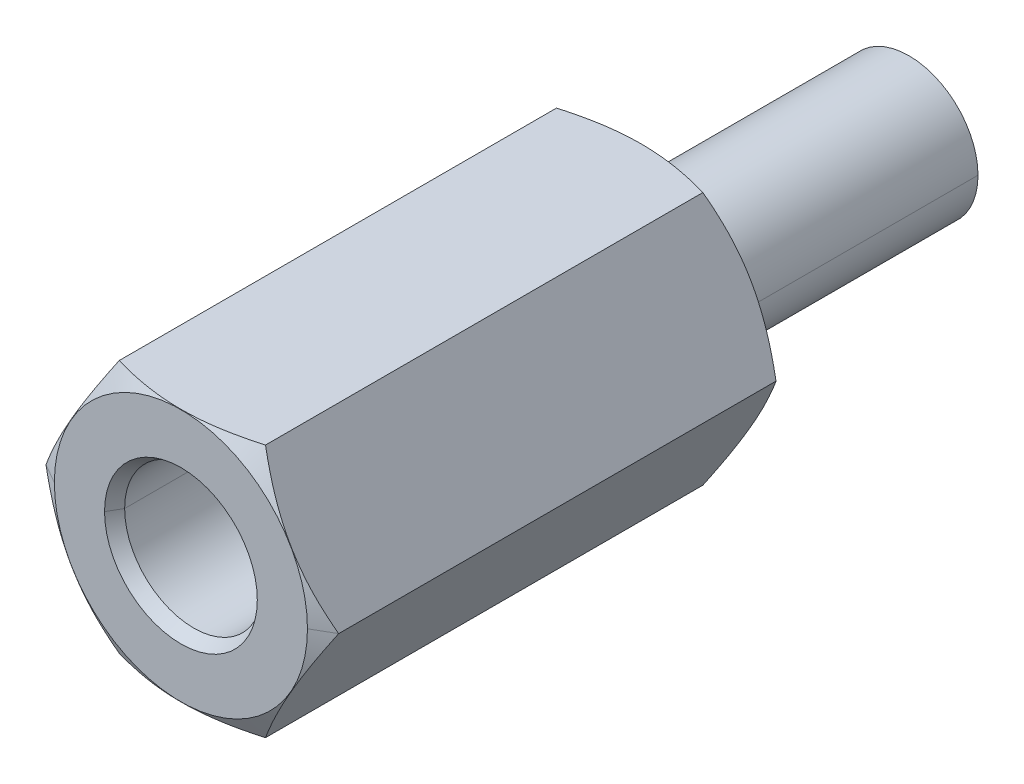
ISO-10303-21;
HEADER;
FILE_DESCRIPTION(('STEP AP214'),'2;1');
FILE_NAME('part.step','',(''),(''),'','','');
FILE_SCHEMA(('AUTOMOTIVE_DESIGN { 1 0 10303 214 1 1 1 1 }'));
ENDSEC;
DATA;
#1=APPLICATION_CONTEXT('core data for automotive mechanical design processes');
#2=APPLICATION_PROTOCOL_DEFINITION('international standard','automotive_design',2000,#1);
#3=PRODUCT_CONTEXT('',#1,'mechanical');
#4=PRODUCT('Part','Part','',(#3));
#5=PRODUCT_RELATED_PRODUCT_CATEGORY('part','',(#4));
#6=PRODUCT_DEFINITION_FORMATION('','',#4);
#7=PRODUCT_DEFINITION_CONTEXT('part definition',#1,'design');
#8=PRODUCT_DEFINITION('design','',#6,#7);
#9=PRODUCT_DEFINITION_SHAPE('','',#8);
#10=(LENGTH_UNIT() NAMED_UNIT(*) SI_UNIT(.MILLI.,.METRE.));
#11=(NAMED_UNIT(*) PLANE_ANGLE_UNIT() SI_UNIT($,.RADIAN.));
#12=(NAMED_UNIT(*) SI_UNIT($,.STERADIAN.) SOLID_ANGLE_UNIT());
#13=UNCERTAINTY_MEASURE_WITH_UNIT(LENGTH_MEASURE(1.E-05),#10,'distance_accuracy_value','');
#14=(GEOMETRIC_REPRESENTATION_CONTEXT(3) GLOBAL_UNCERTAINTY_ASSIGNED_CONTEXT((#13)) GLOBAL_UNIT_ASSIGNED_CONTEXT((#10,
#11,#12)) REPRESENTATION_CONTEXT('',''));
#15=CARTESIAN_POINT('',(0.,0.,0.));
#16=DIRECTION('',(0.,0.,1.));
#17=DIRECTION('',(1.,0.,0.));
#18=AXIS2_PLACEMENT_3D('',#15,#16,#17);
#19=CARTESIAN_POINT('',(6.36000000000024,-1.10550841098903E-13,-23.3835844822183));
#20=DIRECTION('',(-0.866025403784329,-0.50000000000019,0.));
#21=DIRECTION('',(-0.50000000000019,0.866025403784329,0.));
#22=AXIS2_PLACEMENT_3D('',#19,#20,#21);
#23=PLANE('',#22);
#24=DIRECTION('',(0.,0.,1.));
#25=VECTOR('',#24,1.);
#26=CARTESIAN_POINT('',(3.18000000000011,5.50792156806995,-23.3835844822183));
#27=LINE('',#26,#25);
#28=CARTESIAN_POINT('',(3.18000000000008,5.50792156806795,-2.88706325071432));
#29=VERTEX_POINT('',#28);
#30=CARTESIAN_POINT('',(3.18000000000008,5.50792156806795,16.1198942862777));
#31=VERTEX_POINT('',#30);
#32=EDGE_CURVE('E11',#29,#31,#27,.T.);
#33=ORIENTED_EDGE('',*,*,#32,.T.);
#34=CARTESIAN_POINT('',(3.18000000000008,5.50792156806795,16.1198942862777));
#35=CARTESIAN_POINT('',(4.77000000000007,2.75396078403398,17.0378812142893));
#36=CARTESIAN_POINT('',(6.36000000000024,-1.10550841098903E-13,16.1198942862777));
#37=(BOUNDED_CURVE() B_SPLINE_CURVE(2,(#34,#35,#36),.UNSPECIFIED.,.F.,
.F.) B_SPLINE_CURVE_WITH_KNOTS((3,3),(0.,1.),
.UNSPECIFIED.) CURVE() GEOMETRIC_REPRESENTATION_ITEM() RATIONAL_B_SPLINE_CURVE((1.,
1.15470053837927,1.)) REPRESENTATION_ITEM(''));
#38=CARTESIAN_POINT('',(6.36000000000024,-1.10550841098903E-13,16.1198942862777));
#39=VERTEX_POINT('',#38);
#40=EDGE_CURVE('E199',#31,#39,#37,.T.);
#41=ORIENTED_EDGE('',*,*,#40,.T.);
#42=DIRECTION('',(0.,0.,1.));
#43=VECTOR('',#42,1.);
#44=CARTESIAN_POINT('',(6.36000000000024,-1.10550841098903E-13,-2.88706325071432));
#45=LINE('',#44,#43);
#46=CARTESIAN_POINT('',(6.36000000000024,-1.10550841098903E-13,-2.88706325071432));
#47=VERTEX_POINT('',#46);
#48=EDGE_CURVE('E215',#47,#39,#45,.T.);
#49=ORIENTED_EDGE('',*,*,#48,.F.);
#50=CARTESIAN_POINT('',(6.36000000000024,-1.10550841098903E-13,-2.88706325071432));
#51=CARTESIAN_POINT('',(4.77000000000027,2.75396078403377,-3.80505017872587));
#52=CARTESIAN_POINT('',(3.18000000000008,5.50792156806795,-2.88706325071432));
#53=(BOUNDED_CURVE() B_SPLINE_CURVE(2,(#50,#51,#52),.UNSPECIFIED.,.F.,
.F.) B_SPLINE_CURVE_WITH_KNOTS((3,3),(0.,1.),
.UNSPECIFIED.) CURVE() GEOMETRIC_REPRESENTATION_ITEM() RATIONAL_B_SPLINE_CURVE((1.,
1.15470053837928,1.)) REPRESENTATION_ITEM(''));
#54=EDGE_CURVE('E323',#47,#29,#53,.T.);
#55=ORIENTED_EDGE('',*,*,#54,.T.);
#56=EDGE_LOOP('',(#33,#41,#49,#55));
#57=FACE_BOUND('',#56,.T.);
#58=ADVANCED_FACE('F17',(#57),#23,.F.);
#59=CARTESIAN_POINT('',(0.,-1.03611947194996E-13,-3.38358448221833));
#60=DIRECTION('',(0.,0.,1.));
#61=DIRECTION('',(1.,0.,0.));
#62=AXIS2_PLACEMENT_3D('',#59,#60,#61);
#63=CONICAL_SURFACE('',#62,5.5,1.047197551197);
#64=DIRECTION('',(-0.866025403784641,0.,0.49999999999965));
#65=VECTOR('',#64,1.);
#66=CARTESIAN_POINT('',(-5.5,-1.02938391455465E-13,-3.38358448221833));
#67=LINE('',#66,#65);
#68=CARTESIAN_POINT('',(-5.5,-1.02938391455465E-13,-3.38358448221833));
#69=VERTEX_POINT('',#68);
#70=CARTESIAN_POINT('',(-6.36,-2.49328719177048E-13,-2.88706325071432));
#71=VERTEX_POINT('',#70);
#72=EDGE_CURVE('E352',#69,#71,#67,.T.);
#73=ORIENTED_EDGE('',*,*,#72,.F.);
#74=CARTESIAN_POINT('',(0.,-1.03611947194996E-13,-3.38358448221833));
#75=DIRECTION('',(0.,0.,1.));
#76=DIRECTION('',(1.,0.,0.));
#77=AXIS2_PLACEMENT_3D('',#74,#75,#76);
#78=CIRCLE('',#77,5.5);
#79=CARTESIAN_POINT('',(5.5000000000001,-1.03611947194996E-13,-3.38358448221833));
#80=VERTEX_POINT('',#79);
#81=EDGE_CURVE('E150',#69,#80,#78,.T.);
#82=ORIENTED_EDGE('',*,*,#81,.T.);
#83=DIRECTION('',(0.866025403784641,0.,0.49999999999965));
#84=VECTOR('',#83,1.);
#85=CARTESIAN_POINT('',(5.5000000000001,-1.03611947194996E-13,-3.38358448221833));
#86=LINE('',#85,#84);
#87=EDGE_CURVE('E319',#80,#47,#86,.T.);
#88=ORIENTED_EDGE('',*,*,#87,.T.);
#89=CARTESIAN_POINT('',(3.18000000000011,-5.50792156806814,-2.88706325071432));
#90=CARTESIAN_POINT('',(4.7700000000001,-2.75396078403431,-3.80505017872587));
#91=CARTESIAN_POINT('',(6.36000000000024,-1.10550841098903E-13,-2.88706325071432));
#92=(BOUNDED_CURVE() B_SPLINE_CURVE(2,(#89,#90,#91),.UNSPECIFIED.,.F.,
.F.) B_SPLINE_CURVE_WITH_KNOTS((3,3),(0.,1.),
.UNSPECIFIED.) CURVE() GEOMETRIC_REPRESENTATION_ITEM() RATIONAL_B_SPLINE_CURVE((1.,
1.15470053837928,1.)) REPRESENTATION_ITEM(''));
#93=CARTESIAN_POINT('',(3.18000000000011,-5.50792156806814,-2.88706325071432));
#94=VERTEX_POINT('',#93);
#95=EDGE_CURVE('E134',#94,#47,#92,.T.);
#96=ORIENTED_EDGE('',*,*,#95,.F.);
#97=CARTESIAN_POINT('',(-3.17999999999995,-5.50792156807011,-2.88706325071432));
#98=CARTESIAN_POINT('',(2.83269422759521E-13,-5.50792156807013,-3.80505017872565));
#99=CARTESIAN_POINT('',(3.18000000000011,-5.50792156806814,-2.88706325071432));
#100=(BOUNDED_CURVE() B_SPLINE_CURVE(2,(#97,#98,#99),.UNSPECIFIED.,.F.,
.F.) B_SPLINE_CURVE_WITH_KNOTS((3,3),(0.,1.),
.UNSPECIFIED.) CURVE() GEOMETRIC_REPRESENTATION_ITEM() RATIONAL_B_SPLINE_CURVE((1.,
1.15470053837918,1.)) REPRESENTATION_ITEM(''));
#101=CARTESIAN_POINT('',(-3.17999999999995,-5.50792156807011,-2.88706325071432));
#102=VERTEX_POINT('',#101);
#103=EDGE_CURVE('E130',#102,#94,#100,.T.);
#104=ORIENTED_EDGE('',*,*,#103,.F.);
#105=CARTESIAN_POINT('',(-6.36,-2.49328719177048E-13,-2.88706325071432));
#106=CARTESIAN_POINT('',(-4.76999999999978,-2.75396078403455,-3.80505017872597));
#107=CARTESIAN_POINT('',(-3.17999999999995,-5.50792156807011,-2.88706325071432));
#108=(BOUNDED_CURVE() B_SPLINE_CURVE(2,(#105,#106,#107),.UNSPECIFIED.,.F.,
.F.) B_SPLINE_CURVE_WITH_KNOTS((3,3),(0.,1.),
.UNSPECIFIED.) CURVE() GEOMETRIC_REPRESENTATION_ITEM() RATIONAL_B_SPLINE_CURVE((1.,
1.15470053837932,1.)) REPRESENTATION_ITEM(''));
#109=EDGE_CURVE('E113',#71,#102,#108,.T.);
#110=ORIENTED_EDGE('',*,*,#109,.F.);
#111=EDGE_LOOP('',(#73,#82,#88,#96,#104,#110));
#112=FACE_BOUND('',#111,.T.);
#113=ADVANCED_FACE('F131',(#112),#63,.T.);
#114=CARTESIAN_POINT('',(3.18000000000011,5.50792156806995,-23.3835844822183));
#115=DIRECTION('',(0.,-1.,0.));
#116=DIRECTION('',(-1.,0.,0.));
#117=AXIS2_PLACEMENT_3D('',#114,#115,#116);
#118=PLANE('',#117);
#119=DIRECTION('',(0.,0.,1.));
#120=VECTOR('',#119,1.);
#121=CARTESIAN_POINT('',(-3.17999999999992,5.5079215680699,-23.3835844822183));
#122=LINE('',#121,#120);
#123=CARTESIAN_POINT('',(-3.17999999999992,5.5079215680699,-2.88706325071432));
#124=VERTEX_POINT('',#123);
#125=CARTESIAN_POINT('',(-3.17999999999992,5.5079215680699,16.1198942862777));
#126=VERTEX_POINT('',#125);
#127=EDGE_CURVE('E259',#124,#126,#122,.T.);
#128=ORIENTED_EDGE('',*,*,#127,.T.);
#129=CARTESIAN_POINT('',(-3.17999999999992,5.5079215680699,16.1198942862777));
#130=CARTESIAN_POINT('',(2.59232389179725E-13,5.50792156806996,17.037881214289));
#131=CARTESIAN_POINT('',(3.18000000000008,5.50792156806795,16.1198942862777));
#132=(BOUNDED_CURVE() B_SPLINE_CURVE(2,(#129,#130,#131),.UNSPECIFIED.,.F.,
.F.) B_SPLINE_CURVE_WITH_KNOTS((3,3),(0.,1.),
.UNSPECIFIED.) CURVE() GEOMETRIC_REPRESENTATION_ITEM() RATIONAL_B_SPLINE_CURVE((1.,
1.15470053837918,1.)) REPRESENTATION_ITEM(''));
#133=EDGE_CURVE('E20',#126,#31,#132,.T.);
#134=ORIENTED_EDGE('',*,*,#133,.T.);
#135=ORIENTED_EDGE('',*,*,#32,.F.);
#136=CARTESIAN_POINT('',(3.18000000000008,5.50792156806795,-2.88706325071432));
#137=CARTESIAN_POINT('',(-1.73434215256602E-13,5.50792156806992,-3.80505017872565));
#138=CARTESIAN_POINT('',(-3.17999999999992,5.5079215680699,-2.88706325071432));
#139=(BOUNDED_CURVE() B_SPLINE_CURVE(2,(#136,#137,#138),.UNSPECIFIED.,.F.,
.F.) B_SPLINE_CURVE_WITH_KNOTS((3,3),(0.,1.),
.UNSPECIFIED.) CURVE() GEOMETRIC_REPRESENTATION_ITEM() RATIONAL_B_SPLINE_CURVE((1.,
1.15470053837918,1.)) REPRESENTATION_ITEM(''));
#140=EDGE_CURVE('E328',#29,#124,#139,.T.);
#141=ORIENTED_EDGE('',*,*,#140,.T.);
#142=EDGE_LOOP('',(#128,#134,#135,#141));
#143=FACE_BOUND('',#142,.T.);
#144=ADVANCED_FACE('F584',(#143),#118,.F.);
#145=CARTESIAN_POINT('',(0.,-1.03611947194996E-13,16.1198942862777));
#146=DIRECTION('',(0.,0.,-1.));
#147=DIRECTION('',(1.,0.,0.));
#148=AXIS2_PLACEMENT_3D('',#145,#146,#147);
#149=CONICAL_SURFACE('',#148,6.36,1.047197551197);
#150=DIRECTION('',(-0.866025403784641,0.,-0.49999999999965));
#151=VECTOR('',#150,1.);
#152=CARTESIAN_POINT('',(-6.36,-1.08274382699392E-13,16.1198942862777));
#153=LINE('',#152,#151);
#154=CARTESIAN_POINT('',(-5.49999999999993,-1.07961044767817E-13,16.6164155177817));
#155=VERTEX_POINT('',#154);
#156=CARTESIAN_POINT('',(-6.36,0.,16.1198942862777));
#157=VERTEX_POINT('',#156);
#158=EDGE_CURVE('E318',#155,#157,#153,.T.);
#159=ORIENTED_EDGE('',*,*,#158,.F.);
#160=CARTESIAN_POINT('',(0.,-1.03611947194996E-13,16.6164155177817));
#161=DIRECTION('',(0.,0.,1.));
#162=DIRECTION('',(1.,0.,0.));
#163=AXIS2_PLACEMENT_3D('',#160,#161,#162);
#164=CIRCLE('',#163,5.5);
#165=CARTESIAN_POINT('',(5.5000000000001,0.,16.6164155177817));
#166=VERTEX_POINT('',#165);
#167=EDGE_CURVE('E247',#166,#155,#164,.T.);
#168=ORIENTED_EDGE('',*,*,#167,.F.);
#169=DIRECTION('',(0.866025403784641,0.,-0.49999999999965));
#170=VECTOR('',#169,1.);
#171=CARTESIAN_POINT('',(6.3600000000001,0.,16.1198942862777));
#172=LINE('',#171,#170);
#173=EDGE_CURVE('E283',#166,#39,#172,.T.);
#174=ORIENTED_EDGE('',*,*,#173,.T.);
#175=ORIENTED_EDGE('',*,*,#40,.F.);
#176=ORIENTED_EDGE('',*,*,#133,.F.);
#177=CARTESIAN_POINT('',(-6.36,0.,16.1198942862777));
#178=CARTESIAN_POINT('',(-4.76999999999973,2.75396078403423,17.0378812142893));
#179=CARTESIAN_POINT('',(-3.17999999999992,5.5079215680699,16.1198942862777));
#180=(BOUNDED_CURVE() B_SPLINE_CURVE(2,(#177,#178,#179),.UNSPECIFIED.,.F.,
.F.) B_SPLINE_CURVE_WITH_KNOTS((3,3),(0.,1.),
.UNSPECIFIED.) CURVE() GEOMETRIC_REPRESENTATION_ITEM() RATIONAL_B_SPLINE_CURVE((1.,
1.15470053837932,1.)) REPRESENTATION_ITEM(''));
#181=EDGE_CURVE('E127',#157,#126,#180,.T.);
#182=ORIENTED_EDGE('',*,*,#181,.F.);
#183=EDGE_LOOP('',(#159,#168,#174,#175,#176,#182));
#184=FACE_BOUND('',#183,.T.);
#185=ADVANCED_FACE('F285',(#184),#149,.T.);
#186=CARTESIAN_POINT('',(3.18000000000016,-5.50792156807017,-23.3835844822183));
#187=DIRECTION('',(-0.866025403784329,0.50000000000019,0.));
#188=DIRECTION('',(0.,0.,1.));
#189=AXIS2_PLACEMENT_3D('',#186,#187,#188);
#190=PLANE('',#189);
#191=ORIENTED_EDGE('',*,*,#48,.T.);
#192=CARTESIAN_POINT('',(6.36000000000024,-1.10550841098903E-13,16.1198942862777));
#193=CARTESIAN_POINT('',(4.77000000000017,-2.75396078403405,17.0378812142892));
#194=CARTESIAN_POINT('',(3.18000000000011,-5.50792156806814,16.1198942862777));
#195=(BOUNDED_CURVE() B_SPLINE_CURVE(2,(#192,#193,#194),.UNSPECIFIED.,.F.,
.F.) B_SPLINE_CURVE_WITH_KNOTS((3,3),(0.,1.),
.UNSPECIFIED.) CURVE() GEOMETRIC_REPRESENTATION_ITEM() RATIONAL_B_SPLINE_CURVE((1.,
1.15470053837928,1.)) REPRESENTATION_ITEM(''));
#196=CARTESIAN_POINT('',(3.18000000000011,-5.50792156806814,16.1198942862777));
#197=VERTEX_POINT('',#196);
#198=EDGE_CURVE('E275',#39,#197,#195,.T.);
#199=ORIENTED_EDGE('',*,*,#198,.T.);
#200=DIRECTION('',(0.,0.,1.));
#201=VECTOR('',#200,1.);
#202=CARTESIAN_POINT('',(3.18000000000016,-5.50792156807017,-23.3835844822183));
#203=LINE('',#202,#201);
#204=EDGE_CURVE('E144',#94,#197,#203,.T.);
#205=ORIENTED_EDGE('',*,*,#204,.F.);
#206=ORIENTED_EDGE('',*,*,#95,.T.);
#207=EDGE_LOOP('',(#191,#199,#205,#206));
#208=FACE_BOUND('',#207,.T.);
#209=ADVANCED_FACE('F273',(#208),#190,.F.);
#210=CARTESIAN_POINT('',(-3.17999999999992,5.5079215680699,-23.3835844822183));
#211=DIRECTION('',(0.866025403784329,-0.50000000000019,0.));
#212=DIRECTION('',(0.,0.,-1.));
#213=AXIS2_PLACEMENT_3D('',#210,#211,#212);
#214=PLANE('',#213);
#215=DIRECTION('',(0.,0.,1.));
#216=VECTOR('',#215,1.);
#217=CARTESIAN_POINT('',(-6.36,-1.38306416714532E-13,-23.3835844822183));
#218=LINE('',#217,#216);
#219=EDGE_CURVE('E122',#71,#157,#218,.T.);
#220=ORIENTED_EDGE('',*,*,#219,.T.);
#221=ORIENTED_EDGE('',*,*,#181,.T.);
#222=ORIENTED_EDGE('',*,*,#127,.F.);
#223=CARTESIAN_POINT('',(-3.17999999999992,5.5079215680699,-2.88706325071432));
#224=CARTESIAN_POINT('',(-4.76999999999933,2.75396078403513,-3.80505017872626));
#225=CARTESIAN_POINT('',(-6.36,-2.49328719177048E-13,-2.88706325071432));
#226=(BOUNDED_CURVE() B_SPLINE_CURVE(2,(#223,#224,#225),.UNSPECIFIED.,.F.,
.F.) B_SPLINE_CURVE_WITH_KNOTS((3,3),(0.,1.),
.UNSPECIFIED.) CURVE() GEOMETRIC_REPRESENTATION_ITEM() RATIONAL_B_SPLINE_CURVE((1.,
1.15470053837944,1.)) REPRESENTATION_ITEM(''));
#227=EDGE_CURVE('E337',#124,#71,#226,.T.);
#228=ORIENTED_EDGE('',*,*,#227,.T.);
#229=EDGE_LOOP('',(#220,#221,#222,#228));
#230=FACE_BOUND('',#229,.T.);
#231=ADVANCED_FACE('F605',(#230),#214,.F.);
#232=CARTESIAN_POINT('',(-6.36,-1.38306416714532E-13,-23.3835844822183));
#233=DIRECTION('',(0.866025403784329,0.50000000000019,0.));
#234=DIRECTION('',(0.,0.,-1.));
#235=AXIS2_PLACEMENT_3D('',#232,#233,#234);
#236=PLANE('',#235);
#237=DIRECTION('',(0.,0.,1.));
#238=VECTOR('',#237,1.);
#239=CARTESIAN_POINT('',(-3.17999999999995,-5.50792156807011,-23.3835844822183));
#240=LINE('',#239,#238);
#241=CARTESIAN_POINT('',(-3.17999999999995,-5.50792156807011,16.1198942862777));
#242=VERTEX_POINT('',#241);
#243=EDGE_CURVE('E118',#102,#242,#240,.T.);
#244=ORIENTED_EDGE('',*,*,#243,.T.);
#245=CARTESIAN_POINT('',(-3.17999999999995,-5.50792156807011,16.1198942862777));
#246=CARTESIAN_POINT('',(-4.76999999999931,-2.75396078403543,17.0378812142896));
#247=CARTESIAN_POINT('',(-6.36,0.,16.1198942862777));
#248=(BOUNDED_CURVE() B_SPLINE_CURVE(2,(#245,#246,#247),.UNSPECIFIED.,.F.,
.F.) B_SPLINE_CURVE_WITH_KNOTS((3,3),(0.,1.),
.UNSPECIFIED.) CURVE() GEOMETRIC_REPRESENTATION_ITEM() RATIONAL_B_SPLINE_CURVE((1.,
1.15470053837944,1.)) REPRESENTATION_ITEM(''));
#249=EDGE_CURVE('E297',#242,#157,#248,.T.);
#250=ORIENTED_EDGE('',*,*,#249,.T.);
#251=ORIENTED_EDGE('',*,*,#219,.F.);
#252=ORIENTED_EDGE('',*,*,#109,.T.);
#253=EDGE_LOOP('',(#244,#250,#251,#252));
#254=FACE_BOUND('',#253,.T.);
#255=ADVANCED_FACE('F115',(#254),#236,.F.);
#256=CARTESIAN_POINT('',(-3.17999999999995,-5.50792156807011,-23.3835844822183));
#257=DIRECTION('',(0.,1.,0.));
#258=DIRECTION('',(1.,0.,0.));
#259=AXIS2_PLACEMENT_3D('',#256,#257,#258);
#260=PLANE('',#259);
#261=ORIENTED_EDGE('',*,*,#204,.T.);
#262=CARTESIAN_POINT('',(3.18000000000011,-5.50792156806814,16.1198942862777));
#263=CARTESIAN_POINT('',(-2.69582349575786E-13,-5.50792156807013,17.037881214289));
#264=CARTESIAN_POINT('',(-3.17999999999995,-5.50792156807011,16.1198942862777));
#265=(BOUNDED_CURVE() B_SPLINE_CURVE(2,(#262,#263,#264),.UNSPECIFIED.,.F.,
.F.) B_SPLINE_CURVE_WITH_KNOTS((3,3),(0.,1.),
.UNSPECIFIED.) CURVE() GEOMETRIC_REPRESENTATION_ITEM() RATIONAL_B_SPLINE_CURVE((1.,
1.15470053837918,1.)) REPRESENTATION_ITEM(''));
#266=EDGE_CURVE('E141',#197,#242,#265,.T.);
#267=ORIENTED_EDGE('',*,*,#266,.T.);
#268=ORIENTED_EDGE('',*,*,#243,.F.);
#269=ORIENTED_EDGE('',*,*,#103,.T.);
#270=EDGE_LOOP('',(#261,#267,#268,#269));
#271=FACE_BOUND('',#270,.T.);
#272=ADVANCED_FACE('F139',(#271),#260,.F.);
#273=CARTESIAN_POINT('',(0.,-1.03611947194996E-13,-3.38358448221833));
#274=DIRECTION('',(0.,0.,1.));
#275=DIRECTION('',(0.,-1.,0.));
#276=AXIS2_PLACEMENT_3D('',#273,#274,#275);
#277=PLANE('',#276);
#278=CARTESIAN_POINT('',(0.,-1.03611947194996E-13,-3.38358448221833));
#279=DIRECTION('',(0.,0.,1.));
#280=DIRECTION('',(1.,0.,0.));
#281=AXIS2_PLACEMENT_3D('',#278,#279,#280);
#282=CIRCLE('',#281,3.);
#283=CARTESIAN_POINT('',(3.00000000000009,-1.03611947194996E-13,-3.38358448221833));
#284=VERTEX_POINT('',#283);
#285=CARTESIAN_POINT('',(-2.99999999999994,-1.00579976869774E-13,-3.38358448221833));
#286=VERTEX_POINT('',#285);
#287=EDGE_CURVE('E160',#284,#286,#282,.T.);
#288=ORIENTED_EDGE('',*,*,#287,.T.);
#289=CARTESIAN_POINT('',(0.,-1.03611947194996E-13,-3.38358448221833));
#290=DIRECTION('',(0.,0.,1.));
#291=DIRECTION('',(1.,0.,0.));
#292=AXIS2_PLACEMENT_3D('',#289,#290,#291);
#293=CIRCLE('',#292,3.);
#294=EDGE_CURVE('E245',#286,#284,#293,.T.);
#295=ORIENTED_EDGE('',*,*,#294,.T.);
#296=EDGE_LOOP('',(#288,#295));
#297=FACE_BOUND('',#296,.T.);
#298=CARTESIAN_POINT('',(0.,-1.03611947194996E-13,-3.38358448221833));
#299=DIRECTION('',(0.,0.,1.));
#300=DIRECTION('',(1.,0.,0.));
#301=AXIS2_PLACEMENT_3D('',#298,#299,#300);
#302=CIRCLE('',#301,5.5);
#303=EDGE_CURVE('E367',#80,#69,#302,.T.);
#304=ORIENTED_EDGE('',*,*,#303,.F.);
#305=ORIENTED_EDGE('',*,*,#81,.F.);
#306=EDGE_LOOP('',(#304,#305));
#307=FACE_BOUND('',#306,.T.);
#308=ADVANCED_FACE('F628',(#297,#307),#277,.F.);
#309=CARTESIAN_POINT('',(0.,-1.03611947194996E-13,16.6164155177817));
#310=DIRECTION('',(0.,0.,1.));
#311=DIRECTION('',(0.,-1.,0.));
#312=AXIS2_PLACEMENT_3D('',#309,#310,#311);
#313=PLANE('',#312);
#314=CARTESIAN_POINT('',(0.,-1.03611947194996E-13,16.6164155177817));
#315=DIRECTION('',(0.,0.,1.));
#316=DIRECTION('',(1.,0.,0.));
#317=AXIS2_PLACEMENT_3D('',#314,#315,#316);
#318=CIRCLE('',#317,3.32);
#319=CARTESIAN_POINT('',(3.32000000000009,0.,16.6164155177817));
#320=VERTEX_POINT('',#319);
#321=CARTESIAN_POINT('',(-3.31999999999995,-1.07444195965698E-13,16.6164155177817));
#322=VERTEX_POINT('',#321);
#323=EDGE_CURVE('E242',#320,#322,#318,.T.);
#324=ORIENTED_EDGE('',*,*,#323,.F.);
#325=CARTESIAN_POINT('',(0.,-1.03611947194996E-13,16.6164155177817));
#326=DIRECTION('',(0.,0.,1.));
#327=DIRECTION('',(1.,0.,0.));
#328=AXIS2_PLACEMENT_3D('',#325,#326,#327);
#329=CIRCLE('',#328,3.32);
#330=EDGE_CURVE('E173',#322,#320,#329,.T.);
#331=ORIENTED_EDGE('',*,*,#330,.F.);
#332=EDGE_LOOP('',(#324,#331));
#333=FACE_BOUND('',#332,.T.);
#334=ORIENTED_EDGE('',*,*,#167,.T.);
#335=CARTESIAN_POINT('',(0.,-1.03611947194996E-13,16.6164155177817));
#336=DIRECTION('',(0.,0.,1.));
#337=DIRECTION('',(1.,0.,0.));
#338=AXIS2_PLACEMENT_3D('',#335,#336,#337);
#339=CIRCLE('',#338,5.5);
#340=EDGE_CURVE('E315',#155,#166,#339,.T.);
#341=ORIENTED_EDGE('',*,*,#340,.T.);
#342=EDGE_LOOP('',(#334,#341));
#343=FACE_BOUND('',#342,.T.);
#344=ADVANCED_FACE('F408',(#333,#343),#313,.T.);
#345=CARTESIAN_POINT('',(0.,-1.03611947194996E-13,-15.0256273153203));
#346=DIRECTION('',(0.,0.,1.));
#347=DIRECTION('',(1.,0.,0.));
#348=AXIS2_PLACEMENT_3D('',#345,#346,#347);
#349=CYLINDRICAL_SURFACE('',#348,3.);
#350=DIRECTION('',(0.,0.,1.));
#351=VECTOR('',#350,1.);
#352=CARTESIAN_POINT('',(-2.99999999999995,-1.00580017896151E-13,-15.0256273153203));
#353=LINE('',#352,#351);
#354=CARTESIAN_POINT('',(-3.00000000000127,0.,-15.0256273153203));
#355=VERTEX_POINT('',#354);
#356=EDGE_CURVE('E156',#355,#286,#353,.T.);
#357=ORIENTED_EDGE('',*,*,#356,.F.);
#358=CARTESIAN_POINT('',(0.,-1.03611947194996E-13,-15.0256273153203));
#359=DIRECTION('',(0.,0.,1.));
#360=DIRECTION('',(1.,0.,0.));
#361=AXIS2_PLACEMENT_3D('',#358,#359,#360);
#362=CIRCLE('',#361,3.);
#363=CARTESIAN_POINT('',(3.00000000000141,-1.07109147199696E-13,-15.0256273153203));
#364=VERTEX_POINT('',#363);
#365=EDGE_CURVE('E239',#355,#364,#362,.T.);
#366=ORIENTED_EDGE('',*,*,#365,.T.);
#367=DIRECTION('',(0.,0.,1.));
#368=VECTOR('',#367,1.);
#369=CARTESIAN_POINT('',(3.00000000000009,-1.06276482454096E-13,-15.0256273153203));
#370=LINE('',#369,#368);
#371=EDGE_CURVE('E161',#364,#284,#370,.T.);
#372=ORIENTED_EDGE('',*,*,#371,.T.);
#373=ORIENTED_EDGE('',*,*,#294,.F.);
#374=EDGE_LOOP('',(#357,#366,#372,#373));
#375=FACE_BOUND('',#374,.T.);
#376=ADVANCED_FACE('F633',(#375),#349,.T.);
#377=CARTESIAN_POINT('',(0.,-1.03611947194996E-13,16.6164155177817));
#378=DIRECTION('',(0.,0.,1.));
#379=DIRECTION('',(1.,0.,0.));
#380=AXIS2_PLACEMENT_3D('',#377,#378,#379);
#381=CONICAL_SURFACE('',#380,3.32,0.523598775598);
#382=DIRECTION('',(-0.499999999999743,0.,0.866025403784587));
#383=VECTOR('',#382,1.);
#384=CARTESIAN_POINT('',(-3.31999999999995,-1.07444195965698E-13,16.6164155177817));
#385=LINE('',#384,#383);
#386=CARTESIAN_POINT('',(-2.99999999999994,-1.08475784819094E-13,16.0621592593597));
#387=VERTEX_POINT('',#386);
#388=EDGE_CURVE('E169',#387,#322,#385,.T.);
#389=ORIENTED_EDGE('',*,*,#388,.F.);
#390=CARTESIAN_POINT('',(0.,-1.03611947194996E-13,16.0621592593597));
#391=DIRECTION('',(0.,0.,1.));
#392=DIRECTION('',(1.,0.,0.));
#393=AXIS2_PLACEMENT_3D('',#390,#391,#392);
#394=CIRCLE('',#393,3.);
#395=CARTESIAN_POINT('',(3.00000000000009,0.,16.0621592593597));
#396=VERTEX_POINT('',#395);
#397=EDGE_CURVE('E190',#396,#387,#394,.T.);
#398=ORIENTED_EDGE('',*,*,#397,.F.);
#399=DIRECTION('',(0.499999999999743,0.,0.866025403784587));
#400=VECTOR('',#399,1.);
#401=CARTESIAN_POINT('',(3.32000000000009,0.,16.6164155177817));
#402=LINE('',#401,#400);
#403=EDGE_CURVE('E177',#396,#320,#402,.T.);
#404=ORIENTED_EDGE('',*,*,#403,.T.);
#405=ORIENTED_EDGE('',*,*,#323,.T.);
#406=EDGE_LOOP('',(#389,#398,#404,#405));
#407=FACE_BOUND('',#406,.T.);
#408=ADVANCED_FACE('F414',(#407),#381,.F.);
#409=CARTESIAN_POINT('',(0.,-1.03611947194996E-13,-15.3835844822184));
#410=DIRECTION('',(0.,0.,1.));
#411=DIRECTION('',(1.,0.,0.));
#412=AXIS2_PLACEMENT_3D('',#409,#410,#411);
#413=CONICAL_SURFACE('',#412,2.38,1.047197551197);
#414=DIRECTION('',(-0.866025403784641,0.,0.49999999999965));
#415=VECTOR('',#414,1.);
#416=CARTESIAN_POINT('',(-2.37999999999995,-1.00546033918261E-13,-15.3835844822184));
#417=LINE('',#416,#415);
#418=CARTESIAN_POINT('',(-2.37999999999994,-1.00146691011536E-13,-15.3835844822184));
#419=VERTEX_POINT('',#418);
#420=EDGE_CURVE('E185',#419,#355,#417,.T.);
#421=ORIENTED_EDGE('',*,*,#420,.F.);
#422=CARTESIAN_POINT('',(0.,-1.03611947194996E-13,-15.3835844822184));
#423=DIRECTION('',(0.,0.,1.));
#424=DIRECTION('',(1.,0.,0.));
#425=AXIS2_PLACEMENT_3D('',#422,#423,#424);
#426=CIRCLE('',#425,2.38);
#427=CARTESIAN_POINT('',(2.38000000000008,-1.06386394533534E-13,-15.3835844822184));
#428=VERTEX_POINT('',#427);
#429=EDGE_CURVE('E238',#419,#428,#426,.T.);
#430=ORIENTED_EDGE('',*,*,#429,.T.);
#431=DIRECTION('',(0.866025403784641,0.,0.49999999999965));
#432=VECTOR('',#431,1.);
#433=CARTESIAN_POINT('',(2.38000000000008,-1.06386394533534E-13,-15.3835844822184));
#434=LINE('',#433,#432);
#435=EDGE_CURVE('E186',#428,#364,#434,.T.);
#436=ORIENTED_EDGE('',*,*,#435,.T.);
#437=ORIENTED_EDGE('',*,*,#365,.F.);
#438=EDGE_LOOP('',(#421,#430,#436,#437));
#439=FACE_BOUND('',#438,.T.);
#440=ADVANCED_FACE('F642',(#439),#413,.T.);
#441=CARTESIAN_POINT('',(0.,-1.03611947194996E-13,16.0621592593597));
#442=DIRECTION('',(0.,0.,-1.));
#443=DIRECTION('',(1.,0.,0.));
#444=AXIS2_PLACEMENT_3D('',#441,#442,#443);
#445=CYLINDRICAL_SURFACE('',#444,3.);
#446=DIRECTION('',(0.,0.,-1.));
#447=VECTOR('',#446,1.);
#448=CARTESIAN_POINT('',(-2.99999999999995,-1.08475744484472E-13,16.0621592593597));
#449=LINE('',#448,#447);
#450=CARTESIAN_POINT('',(-2.99999999999995,-1.05076421145883E-13,4.61641551778168));
#451=VERTEX_POINT('',#450);
#452=EDGE_CURVE('E194',#387,#451,#449,.T.);
#453=ORIENTED_EDGE('',*,*,#452,.F.);
#454=CARTESIAN_POINT('',(0.,-1.03611947194996E-13,16.0621592593597));
#455=DIRECTION('',(0.,0.,1.));
#456=DIRECTION('',(1.,0.,0.));
#457=AXIS2_PLACEMENT_3D('',#454,#455,#456);
#458=CIRCLE('',#457,3.);
#459=EDGE_CURVE('E165',#387,#396,#458,.T.);
#460=ORIENTED_EDGE('',*,*,#459,.T.);
#461=DIRECTION('',(0.,0.,-1.));
#462=VECTOR('',#461,1.);
#463=CARTESIAN_POINT('',(3.00000000000009,0.,16.0621592593597));
#464=LINE('',#463,#462);
#465=CARTESIAN_POINT('',(3.00000000000009,-1.01780079204364E-13,4.61641551778168));
#466=VERTEX_POINT('',#465);
#467=EDGE_CURVE('E210',#396,#466,#464,.T.);
#468=ORIENTED_EDGE('',*,*,#467,.T.);
#469=CARTESIAN_POINT('',(0.,-1.03611947194996E-13,4.61641551778168));
#470=DIRECTION('',(0.,0.,1.));
#471=DIRECTION('',(1.,0.,0.));
#472=AXIS2_PLACEMENT_3D('',#469,#470,#471);
#473=CIRCLE('',#472,3.);
#474=EDGE_CURVE('E235',#451,#466,#473,.T.);
#475=ORIENTED_EDGE('',*,*,#474,.F.);
#476=EDGE_LOOP('',(#453,#460,#468,#475));
#477=FACE_BOUND('',#476,.T.);
#478=ADVANCED_FACE('F419',(#477),#445,.F.);
#479=CARTESIAN_POINT('',(0.,-1.03611947194996E-13,-15.3835844822184));
#480=DIRECTION('',(0.,0.,1.));
#481=DIRECTION('',(0.,-1.,0.));
#482=AXIS2_PLACEMENT_3D('',#479,#480,#481);
#483=PLANE('',#482);
#484=CARTESIAN_POINT('',(0.,-1.03611947194996E-13,-15.3835844822184));
#485=DIRECTION('',(0.,0.,1.));
#486=DIRECTION('',(1.,0.,0.));
#487=AXIS2_PLACEMENT_3D('',#484,#485,#486);
#488=CIRCLE('',#487,2.38);
#489=EDGE_CURVE('E181',#428,#419,#488,.T.);
#490=ORIENTED_EDGE('',*,*,#489,.F.);
#491=ORIENTED_EDGE('',*,*,#429,.F.);
#492=EDGE_LOOP('',(#490,#491));
#493=FACE_BOUND('',#492,.T.);
#494=ADVANCED_FACE('F654',(#493),#483,.F.);
#495=CARTESIAN_POINT('',(0.,-1.03611947194996E-13,4.61641551778168));
#496=DIRECTION('',(0.,0.,1.));
#497=DIRECTION('',(1.,0.,0.));
#498=AXIS2_PLACEMENT_3D('',#495,#496,#497);
#499=CONICAL_SURFACE('',#498,3.,1.047197551197);
#500=DIRECTION('',(-0.866025403784641,0.,0.49999999999965));
#501=VECTOR('',#500,1.);
#502=CARTESIAN_POINT('',(-2.99999999999995,-1.05076421145883E-13,4.61641551778168));
#503=LINE('',#502,#501);
#504=CARTESIAN_POINT('',(0.,-1.03611947194996E-13,2.88436471021368));
#505=VERTEX_POINT('',#504);
#506=EDGE_CURVE('E225',#505,#451,#503,.T.);
#507=ORIENTED_EDGE('',*,*,#506,.F.);
#508=DIRECTION('',(0.866025403784641,0.,0.49999999999965));
#509=VECTOR('',#508,1.);
#510=CARTESIAN_POINT('',(3.00000000000009,-1.01780079204364E-13,4.61641551778168));
#511=LINE('',#510,#509);
#512=EDGE_CURVE('E222',#505,#466,#511,.T.);
#513=ORIENTED_EDGE('',*,*,#512,.T.);
#514=CARTESIAN_POINT('',(0.,-1.03611947194996E-13,4.61641551778168));
#515=DIRECTION('',(0.,0.,1.));
#516=DIRECTION('',(1.,0.,0.));
#517=AXIS2_PLACEMENT_3D('',#514,#515,#516);
#518=CIRCLE('',#517,3.);
#519=EDGE_CURVE('E198',#466,#451,#518,.T.);
#520=ORIENTED_EDGE('',*,*,#519,.T.);
#521=EDGE_LOOP('',(#507,#513,#520));
#522=FACE_BOUND('',#521,.T.);
#523=ADVANCED_FACE('F425',(#522),#499,.F.);
#524=CARTESIAN_POINT('',(0.,-1.03611947194996E-13,4.61641551778168));
#525=DIRECTION('',(0.,0.,1.));
#526=DIRECTION('',(1.,0.,0.));
#527=AXIS2_PLACEMENT_3D('',#524,#525,#526);
#528=CONICAL_SURFACE('',#527,3.,1.047197551197);
#529=ORIENTED_EDGE('',*,*,#512,.F.);
#530=ORIENTED_EDGE('',*,*,#506,.T.);
#531=ORIENTED_EDGE('',*,*,#474,.T.);
#532=EDGE_LOOP('',(#529,#530,#531));
#533=FACE_BOUND('',#532,.T.);
#534=ADVANCED_FACE('F678',(#533),#528,.F.);
#535=CARTESIAN_POINT('',(0.,-1.03611947194996E-13,16.0621592593597));
#536=DIRECTION('',(0.,0.,-1.));
#537=DIRECTION('',(1.,0.,0.));
#538=AXIS2_PLACEMENT_3D('',#535,#536,#537);
#539=CYLINDRICAL_SURFACE('',#538,3.);
#540=ORIENTED_EDGE('',*,*,#397,.T.);
#541=ORIENTED_EDGE('',*,*,#452,.T.);
#542=ORIENTED_EDGE('',*,*,#519,.F.);
#543=ORIENTED_EDGE('',*,*,#467,.F.);
#544=EDGE_LOOP('',(#540,#541,#542,#543));
#545=FACE_BOUND('',#544,.T.);
#546=ADVANCED_FACE('F423',(#545),#539,.F.);
#547=CARTESIAN_POINT('',(0.,-1.03611947194996E-13,-15.3835844822184));
#548=DIRECTION('',(0.,0.,1.));
#549=DIRECTION('',(1.,0.,0.));
#550=AXIS2_PLACEMENT_3D('',#547,#548,#549);
#551=CONICAL_SURFACE('',#550,2.38,1.047197551197);
#552=ORIENTED_EDGE('',*,*,#489,.T.);
#553=ORIENTED_EDGE('',*,*,#420,.T.);
#554=CARTESIAN_POINT('',(0.,-1.03611947194996E-13,-15.0256273153203));
#555=DIRECTION('',(0.,0.,1.));
#556=DIRECTION('',(1.,0.,0.));
#557=AXIS2_PLACEMENT_3D('',#554,#555,#556);
#558=CIRCLE('',#557,3.);
#559=EDGE_CURVE('E154',#364,#355,#558,.T.);
#560=ORIENTED_EDGE('',*,*,#559,.F.);
#561=ORIENTED_EDGE('',*,*,#435,.F.);
#562=EDGE_LOOP('',(#552,#553,#560,#561));
#563=FACE_BOUND('',#562,.T.);
#564=ADVANCED_FACE('F691',(#563),#551,.T.);
#565=CARTESIAN_POINT('',(0.,-1.03611947194996E-13,16.6164155177817));
#566=DIRECTION('',(0.,0.,1.));
#567=DIRECTION('',(1.,0.,0.));
#568=AXIS2_PLACEMENT_3D('',#565,#566,#567);
#569=CONICAL_SURFACE('',#568,3.32,0.523598775598);
#570=ORIENTED_EDGE('',*,*,#459,.F.);
#571=ORIENTED_EDGE('',*,*,#388,.T.);
#572=ORIENTED_EDGE('',*,*,#330,.T.);
#573=ORIENTED_EDGE('',*,*,#403,.F.);
#574=EDGE_LOOP('',(#570,#571,#572,#573));
#575=FACE_BOUND('',#574,.T.);
#576=ADVANCED_FACE('F417',(#575),#569,.F.);
#577=CARTESIAN_POINT('',(0.,-1.03611947194996E-13,-15.0256273153203));
#578=DIRECTION('',(0.,0.,1.));
#579=DIRECTION('',(1.,0.,0.));
#580=AXIS2_PLACEMENT_3D('',#577,#578,#579);
#581=CYLINDRICAL_SURFACE('',#580,3.);
#582=ORIENTED_EDGE('',*,*,#559,.T.);
#583=ORIENTED_EDGE('',*,*,#356,.T.);
#584=ORIENTED_EDGE('',*,*,#287,.F.);
#585=ORIENTED_EDGE('',*,*,#371,.F.);
#586=EDGE_LOOP('',(#582,#583,#584,#585));
#587=FACE_BOUND('',#586,.T.);
#588=ADVANCED_FACE('F703',(#587),#581,.T.);
#589=CARTESIAN_POINT('',(0.,-1.03611947194996E-13,16.1198942862777));
#590=DIRECTION('',(0.,0.,-1.));
#591=DIRECTION('',(1.,0.,0.));
#592=AXIS2_PLACEMENT_3D('',#589,#590,#591);
#593=CONICAL_SURFACE('',#592,6.36,1.047197551197);
#594=ORIENTED_EDGE('',*,*,#340,.F.);
#595=ORIENTED_EDGE('',*,*,#158,.T.);
#596=ORIENTED_EDGE('',*,*,#249,.F.);
#597=ORIENTED_EDGE('',*,*,#266,.F.);
#598=ORIENTED_EDGE('',*,*,#198,.F.);
#599=ORIENTED_EDGE('',*,*,#173,.F.);
#600=EDGE_LOOP('',(#594,#595,#596,#597,#598,#599));
#601=FACE_BOUND('',#600,.T.);
#602=ADVANCED_FACE('F291',(#601),#593,.T.);
#603=CARTESIAN_POINT('',(0.,-1.03611947194996E-13,-3.38358448221833));
#604=DIRECTION('',(0.,0.,1.));
#605=DIRECTION('',(1.,0.,0.));
#606=AXIS2_PLACEMENT_3D('',#603,#604,#605);
#607=CONICAL_SURFACE('',#606,5.5,1.047197551197);
#608=ORIENTED_EDGE('',*,*,#303,.T.);
#609=ORIENTED_EDGE('',*,*,#72,.T.);
#610=ORIENTED_EDGE('',*,*,#227,.F.);
#611=ORIENTED_EDGE('',*,*,#140,.F.);
#612=ORIENTED_EDGE('',*,*,#54,.F.);
#613=ORIENTED_EDGE('',*,*,#87,.F.);
#614=EDGE_LOOP('',(#608,#609,#610,#611,#612,#613));
#615=FACE_BOUND('',#614,.T.);
#616=ADVANCED_FACE('F387',(#615),#607,.T.);
#617=CLOSED_SHELL('',(#58,#113,#144,#185,#209,#231,#255,#272,#308,#344,#376,#408,#440,#478,#494,
#523,#534,#546,#564,#576,#588,#602,#616));
#618=MANIFOLD_SOLID_BREP('B1',#617);
#619=ADVANCED_BREP_SHAPE_REPRESENTATION('',(#18,#618),#14);
#620=SHAPE_DEFINITION_REPRESENTATION(#9,#619);
ENDSEC;
END-ISO-10303-21;
